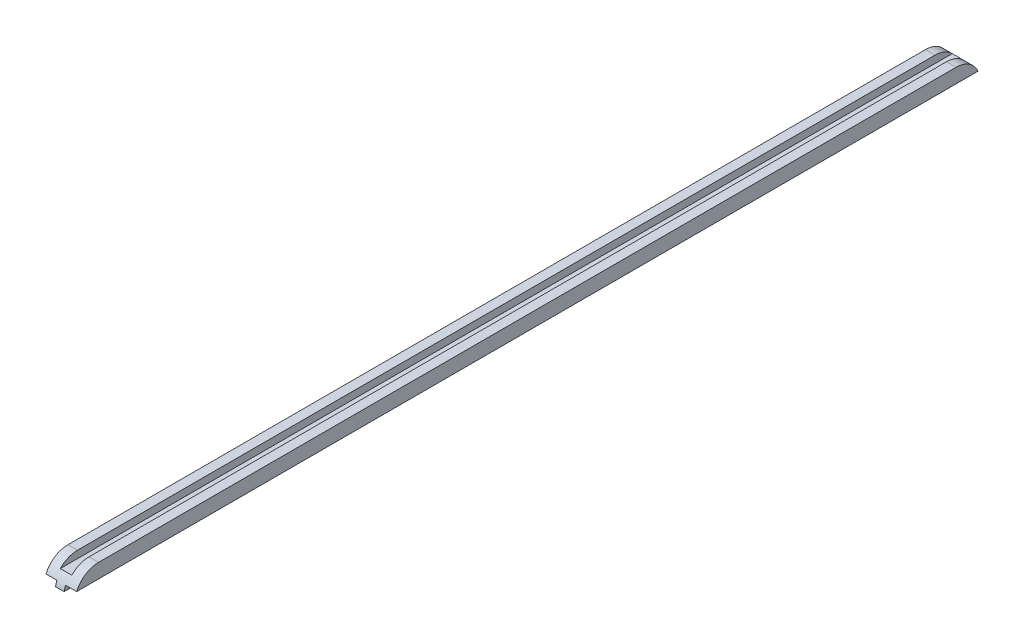
ISO-10303-21;
HEADER;
FILE_DESCRIPTION(('STEP AP214'),'2;1');
FILE_NAME('part.step','',(''),(''),'','','');
FILE_SCHEMA(('AUTOMOTIVE_DESIGN { 1 0 10303 214 1 1 1 1 }'));
ENDSEC;
DATA;
#1=APPLICATION_CONTEXT('core data for automotive mechanical design processes');
#2=APPLICATION_PROTOCOL_DEFINITION('international standard','automotive_design',2000,#1);
#3=PRODUCT_CONTEXT('',#1,'mechanical');
#4=PRODUCT('Part','Part','',(#3));
#5=PRODUCT_RELATED_PRODUCT_CATEGORY('part','',(#4));
#6=PRODUCT_DEFINITION_FORMATION('','',#4);
#7=PRODUCT_DEFINITION_CONTEXT('part definition',#1,'design');
#8=PRODUCT_DEFINITION('design','',#6,#7);
#9=PRODUCT_DEFINITION_SHAPE('','',#8);
#10=(LENGTH_UNIT() NAMED_UNIT(*) SI_UNIT(.MILLI.,.METRE.));
#11=(NAMED_UNIT(*) PLANE_ANGLE_UNIT() SI_UNIT($,.RADIAN.));
#12=(NAMED_UNIT(*) SI_UNIT($,.STERADIAN.) SOLID_ANGLE_UNIT());
#13=UNCERTAINTY_MEASURE_WITH_UNIT(LENGTH_MEASURE(1.E-05),#10,'distance_accuracy_value','');
#14=(GEOMETRIC_REPRESENTATION_CONTEXT(3) GLOBAL_UNCERTAINTY_ASSIGNED_CONTEXT((#13)) GLOBAL_UNIT_ASSIGNED_CONTEXT((#10,
#11,#12)) REPRESENTATION_CONTEXT('',''));
#15=CARTESIAN_POINT('',(0.,0.,0.));
#16=DIRECTION('',(0.,0.,1.));
#17=DIRECTION('',(1.,0.,0.));
#18=AXIS2_PLACEMENT_3D('',#15,#16,#17);
#19=CARTESIAN_POINT('',(-2.65740740740741,0.,189.));
#20=DIRECTION('',(0.,1.,0.));
#21=DIRECTION('',(0.,0.,1.));
#22=AXIS2_PLACEMENT_3D('',#19,#20,#21);
#23=PLANE('',#22);
#24=DIRECTION('',(0.,0.,1.));
#25=VECTOR('',#24,1.);
#26=CARTESIAN_POINT('',(1.44259259259259,0.,-2.05912602819741));
#27=LINE('',#26,#25);
#28=CARTESIAN_POINT('',(1.44259259259259,0.,0.316403790610517));
#29=VERTEX_POINT('',#28);
#30=CARTESIAN_POINT('',(1.44259259259259,0.,188.683596209389));
#31=VERTEX_POINT('',#30);
#32=EDGE_CURVE('E168',#29,#31,#27,.T.);
#33=ORIENTED_EDGE('',*,*,#32,.F.);
#34=DIRECTION('',(1.,0.,0.));
#35=VECTOR('',#34,1.);
#36=CARTESIAN_POINT('',(1.44259259259259,0.,0.316403790610517));
#37=LINE('',#36,#35);
#38=CARTESIAN_POINT('',(3.74259259259259,0.,0.316403790610516));
#39=VERTEX_POINT('',#38);
#40=EDGE_CURVE('E50',#29,#39,#37,.T.);
#41=ORIENTED_EDGE('',*,*,#40,.T.);
#42=DIRECTION('',(0.,0.,-1.));
#43=VECTOR('',#42,1.);
#44=CARTESIAN_POINT('',(3.74259259259259,0.,189.));
#45=LINE('',#44,#43);
#46=CARTESIAN_POINT('',(3.74259259259259,0.,188.683596209389));
#47=VERTEX_POINT('',#46);
#48=EDGE_CURVE('E182',#47,#39,#45,.T.);
#49=ORIENTED_EDGE('',*,*,#48,.F.);
#50=DIRECTION('',(1.,0.,0.));
#51=VECTOR('',#50,1.);
#52=CARTESIAN_POINT('',(3.74259259259259,0.,188.683596209389));
#53=LINE('',#52,#51);
#54=EDGE_CURVE('E260',#47,#31,#53,.F.);
#55=ORIENTED_EDGE('',*,*,#54,.T.);
#56=EDGE_LOOP('',(#33,#41,#49,#55));
#57=FACE_BOUND('',#56,.T.);
#58=ADVANCED_FACE('F33',(#57),#23,.F.);
#59=CARTESIAN_POINT('',(3.74259259259259,0.,189.));
#60=DIRECTION('',(-1.,0.,0.));
#61=DIRECTION('',(0.,0.,1.));
#62=AXIS2_PLACEMENT_3D('',#59,#60,#61);
#63=PLANE('',#62);
#64=ORIENTED_EDGE('',*,*,#48,.T.);
#65=CARTESIAN_POINT('',(3.74259259259259,-2.,4.89897948556636));
#66=DIRECTION('',(-1.,0.,0.));
#67=DIRECTION('',(0.,0.,1.));
#68=AXIS2_PLACEMENT_3D('',#65,#66,#67);
#69=CIRCLE('',#68,5.);
#70=CARTESIAN_POINT('',(3.74259259259259,3.,4.89897948556636));
#71=VERTEX_POINT('',#70);
#72=EDGE_CURVE('E11',#39,#71,#69,.F.);
#73=ORIENTED_EDGE('',*,*,#72,.T.);
#74=DIRECTION('',(0.,0.,-1.));
#75=VECTOR('',#74,1.);
#76=CARTESIAN_POINT('',(3.74259259259259,3.,189.));
#77=LINE('',#76,#75);
#78=CARTESIAN_POINT('',(3.74259259259259,3.,184.101020514434));
#79=VERTEX_POINT('',#78);
#80=EDGE_CURVE('E215',#79,#71,#77,.T.);
#81=ORIENTED_EDGE('',*,*,#80,.F.);
#82=CARTESIAN_POINT('',(3.74259259259259,-2.,184.101020514434));
#83=DIRECTION('',(-1.,0.,0.));
#84=DIRECTION('',(0.,0.,1.));
#85=AXIS2_PLACEMENT_3D('',#82,#83,#84);
#86=CIRCLE('',#85,5.);
#87=EDGE_CURVE('E42',#79,#47,#86,.F.);
#88=ORIENTED_EDGE('',*,*,#87,.T.);
#89=EDGE_LOOP('',(#64,#73,#81,#88));
#90=FACE_BOUND('',#89,.T.);
#91=ADVANCED_FACE('F217',(#90),#63,.F.);
#92=CARTESIAN_POINT('',(3.74259259259259,3.,189.));
#93=DIRECTION('',(0.,-1.,0.));
#94=DIRECTION('',(0.,0.,-1.));
#95=AXIS2_PLACEMENT_3D('',#92,#93,#94);
#96=PLANE('',#95);
#97=ORIENTED_EDGE('',*,*,#80,.T.);
#98=DIRECTION('',(1.,0.,0.));
#99=VECTOR('',#98,1.);
#100=CARTESIAN_POINT('',(3.74259259259259,3.,4.89897948556636));
#101=LINE('',#100,#99);
#102=CARTESIAN_POINT('',(1.74259259259259,3.,4.89897948556636));
#103=VERTEX_POINT('',#102);
#104=EDGE_CURVE('E161',#71,#103,#101,.F.);
#105=ORIENTED_EDGE('',*,*,#104,.T.);
#106=DIRECTION('',(0.,0.,-1.));
#107=VECTOR('',#106,1.);
#108=CARTESIAN_POINT('',(1.74259259259259,3.,189.));
#109=LINE('',#108,#107);
#110=CARTESIAN_POINT('',(1.74259259259259,3.,184.101020514434));
#111=VERTEX_POINT('',#110);
#112=EDGE_CURVE('E208',#111,#103,#109,.T.);
#113=ORIENTED_EDGE('',*,*,#112,.F.);
#114=DIRECTION('',(1.,0.,0.));
#115=VECTOR('',#114,1.);
#116=CARTESIAN_POINT('',(3.74259259259259,3.,184.101020514434));
#117=LINE('',#116,#115);
#118=EDGE_CURVE('E159',#111,#79,#117,.T.);
#119=ORIENTED_EDGE('',*,*,#118,.T.);
#120=EDGE_LOOP('',(#97,#105,#113,#119));
#121=FACE_BOUND('',#120,.T.);
#122=ADVANCED_FACE('F214',(#121),#96,.F.);
#123=CARTESIAN_POINT('',(1.74259259259259,3.,189.));
#124=DIRECTION('',(1.,0.,0.));
#125=DIRECTION('',(0.,1.,0.));
#126=AXIS2_PLACEMENT_3D('',#123,#124,#125);
#127=PLANE('',#126);
#128=ORIENTED_EDGE('',*,*,#112,.T.);
#129=CARTESIAN_POINT('',(1.74259259259259,-2.,4.89897948556636));
#130=DIRECTION('',(1.,0.,0.));
#131=DIRECTION('',(0.,1.,0.));
#132=AXIS2_PLACEMENT_3D('',#129,#130,#131);
#133=CIRCLE('',#132,5.);
#134=CARTESIAN_POINT('',(1.74259259259259,1.47685185185185,1.30572174358981));
#135=VERTEX_POINT('',#134);
#136=EDGE_CURVE('E165',#103,#135,#133,.F.);
#137=ORIENTED_EDGE('',*,*,#136,.T.);
#138=DIRECTION('',(0.,0.,-1.));
#139=VECTOR('',#138,1.);
#140=CARTESIAN_POINT('',(1.74259259259259,1.47685185185185,189.));
#141=LINE('',#140,#139);
#142=CARTESIAN_POINT('',(1.74259259259259,1.47685185185185,187.69427825641));
#143=VERTEX_POINT('',#142);
#144=EDGE_CURVE('E197',#143,#135,#141,.T.);
#145=ORIENTED_EDGE('',*,*,#144,.F.);
#146=CARTESIAN_POINT('',(1.74259259259259,-2.,184.101020514434));
#147=DIRECTION('',(1.,0.,0.));
#148=DIRECTION('',(0.,1.,0.));
#149=AXIS2_PLACEMENT_3D('',#146,#147,#148);
#150=CIRCLE('',#149,5.);
#151=EDGE_CURVE('E163',#143,#111,#150,.F.);
#152=ORIENTED_EDGE('',*,*,#151,.T.);
#153=EDGE_LOOP('',(#128,#137,#145,#152));
#154=FACE_BOUND('',#153,.T.);
#155=ADVANCED_FACE('F205',(#154),#127,.F.);
#156=CARTESIAN_POINT('',(1.74259259259259,1.47685185185185,189.));
#157=DIRECTION('',(0.,-1.,0.));
#158=DIRECTION('',(1.,0.,0.));
#159=AXIS2_PLACEMENT_3D('',#156,#157,#158);
#160=PLANE('',#159);
#161=DIRECTION('',(1.,0.,0.));
#162=VECTOR('',#161,1.);
#163=CARTESIAN_POINT('',(1.74259259259259,1.47685185185185,1.30572174358982));
#164=LINE('',#163,#162);
#165=CARTESIAN_POINT('',(-0.657407407407413,1.47685185185185,1.30572174358981));
#166=VERTEX_POINT('',#165);
#167=EDGE_CURVE('E157',#135,#166,#164,.F.);
#168=ORIENTED_EDGE('',*,*,#167,.T.);
#169=DIRECTION('',(0.,0.,-1.));
#170=VECTOR('',#169,1.);
#171=CARTESIAN_POINT('',(-0.657407407407413,1.47685185185185,189.));
#172=LINE('',#171,#170);
#173=CARTESIAN_POINT('',(-0.657407407407413,1.47685185185185,187.69427825641));
#174=VERTEX_POINT('',#173);
#175=EDGE_CURVE('E200',#174,#166,#172,.T.);
#176=ORIENTED_EDGE('',*,*,#175,.F.);
#177=DIRECTION('',(1.,0.,0.));
#178=VECTOR('',#177,1.);
#179=CARTESIAN_POINT('',(-0.657407407407413,1.47685185185185,187.69427825641));
#180=LINE('',#179,#178);
#181=EDGE_CURVE('E149',#174,#143,#180,.T.);
#182=ORIENTED_EDGE('',*,*,#181,.T.);
#183=ORIENTED_EDGE('',*,*,#144,.T.);
#184=EDGE_LOOP('',(#168,#176,#182,#183));
#185=FACE_BOUND('',#184,.T.);
#186=ADVANCED_FACE('F196',(#185),#160,.F.);
#187=CARTESIAN_POINT('',(-0.657407407407413,1.47685185185185,189.));
#188=DIRECTION('',(-1.,0.,0.));
#189=DIRECTION('',(0.,-1.,0.));
#190=AXIS2_PLACEMENT_3D('',#187,#188,#189);
#191=PLANE('',#190);
#192=ORIENTED_EDGE('',*,*,#175,.T.);
#193=CARTESIAN_POINT('',(-0.657407407407413,-2.,4.89897948556636));
#194=DIRECTION('',(-1.,0.,0.));
#195=DIRECTION('',(0.,-1.,0.));
#196=AXIS2_PLACEMENT_3D('',#193,#194,#195);
#197=CIRCLE('',#196,5.);
#198=CARTESIAN_POINT('',(-0.657407407407413,3.,4.89897948556636));
#199=VERTEX_POINT('',#198);
#200=EDGE_CURVE('E156',#166,#199,#197,.F.);
#201=ORIENTED_EDGE('',*,*,#200,.T.);
#202=DIRECTION('',(0.,0.,-1.));
#203=VECTOR('',#202,1.);
#204=CARTESIAN_POINT('',(-0.657407407407413,3.,189.));
#205=LINE('',#204,#203);
#206=CARTESIAN_POINT('',(-0.657407407407413,3.,184.101020514434));
#207=VERTEX_POINT('',#206);
#208=EDGE_CURVE('E247',#207,#199,#205,.T.);
#209=ORIENTED_EDGE('',*,*,#208,.F.);
#210=CARTESIAN_POINT('',(-0.657407407407413,-2.,184.101020514434));
#211=DIRECTION('',(-1.,0.,0.));
#212=DIRECTION('',(0.,-1.,0.));
#213=AXIS2_PLACEMENT_3D('',#210,#211,#212);
#214=CIRCLE('',#213,5.);
#215=EDGE_CURVE('E154',#207,#174,#214,.F.);
#216=ORIENTED_EDGE('',*,*,#215,.T.);
#217=EDGE_LOOP('',(#192,#201,#209,#216));
#218=FACE_BOUND('',#217,.T.);
#219=ADVANCED_FACE('F250',(#218),#191,.F.);
#220=CARTESIAN_POINT('',(-0.657407407407413,3.,189.));
#221=DIRECTION('',(0.,-1.,0.));
#222=DIRECTION('',(0.,0.,-1.));
#223=AXIS2_PLACEMENT_3D('',#220,#221,#222);
#224=PLANE('',#223);
#225=ORIENTED_EDGE('',*,*,#208,.T.);
#226=DIRECTION('',(1.,0.,0.));
#227=VECTOR('',#226,1.);
#228=CARTESIAN_POINT('',(-0.657407407407413,3.,4.89897948556636));
#229=LINE('',#228,#227);
#230=CARTESIAN_POINT('',(-2.65740740740741,3.,4.89897948556636));
#231=VERTEX_POINT('',#230);
#232=EDGE_CURVE('E221',#199,#231,#229,.F.);
#233=ORIENTED_EDGE('',*,*,#232,.T.);
#234=DIRECTION('',(0.,0.,-1.));
#235=VECTOR('',#234,1.);
#236=CARTESIAN_POINT('',(-2.65740740740741,3.,189.));
#237=LINE('',#236,#235);
#238=CARTESIAN_POINT('',(-2.65740740740741,3.,184.101020514434));
#239=VERTEX_POINT('',#238);
#240=EDGE_CURVE('E241',#239,#231,#237,.T.);
#241=ORIENTED_EDGE('',*,*,#240,.F.);
#242=DIRECTION('',(1.,0.,0.));
#243=VECTOR('',#242,1.);
#244=CARTESIAN_POINT('',(-0.657407407407413,3.,184.101020514434));
#245=LINE('',#244,#243);
#246=EDGE_CURVE('E219',#239,#207,#245,.T.);
#247=ORIENTED_EDGE('',*,*,#246,.T.);
#248=EDGE_LOOP('',(#225,#233,#241,#247));
#249=FACE_BOUND('',#248,.T.);
#250=ADVANCED_FACE('F246',(#249),#224,.F.);
#251=CARTESIAN_POINT('',(-2.65740740740741,3.,189.));
#252=DIRECTION('',(1.,0.,0.));
#253=DIRECTION('',(0.,1.,0.));
#254=AXIS2_PLACEMENT_3D('',#251,#252,#253);
#255=PLANE('',#254);
#256=ORIENTED_EDGE('',*,*,#240,.T.);
#257=CARTESIAN_POINT('',(-2.65740740740741,-2.,4.89897948556636));
#258=DIRECTION('',(1.,0.,0.));
#259=DIRECTION('',(0.,1.,0.));
#260=AXIS2_PLACEMENT_3D('',#257,#258,#259);
#261=CIRCLE('',#260,5.);
#262=CARTESIAN_POINT('',(-2.65740740740741,0.,0.316403790610514));
#263=VERTEX_POINT('',#262);
#264=EDGE_CURVE('E229',#231,#263,#261,.F.);
#265=ORIENTED_EDGE('',*,*,#264,.T.);
#266=DIRECTION('',(0.,0.,-1.));
#267=VECTOR('',#266,1.);
#268=CARTESIAN_POINT('',(-2.65740740740741,0.,189.));
#269=LINE('',#268,#267);
#270=CARTESIAN_POINT('',(-2.65740740740741,0.,188.683596209389));
#271=VERTEX_POINT('',#270);
#272=EDGE_CURVE('E235',#271,#263,#269,.T.);
#273=ORIENTED_EDGE('',*,*,#272,.F.);
#274=CARTESIAN_POINT('',(-2.65740740740741,-2.,184.101020514434));
#275=DIRECTION('',(1.,0.,0.));
#276=DIRECTION('',(0.,1.,0.));
#277=AXIS2_PLACEMENT_3D('',#274,#275,#276);
#278=CIRCLE('',#277,5.);
#279=EDGE_CURVE('E227',#271,#239,#278,.F.);
#280=ORIENTED_EDGE('',*,*,#279,.T.);
#281=EDGE_LOOP('',(#256,#265,#273,#280));
#282=FACE_BOUND('',#281,.T.);
#283=ADVANCED_FACE('F239',(#282),#255,.F.);
#284=ORIENTED_EDGE('',*,*,#272,.T.);
#285=DIRECTION('',(1.,0.,0.));
#286=VECTOR('',#285,1.);
#287=CARTESIAN_POINT('',(-2.65740740740741,0.,0.316403790610523));
#288=LINE('',#287,#286);
#289=CARTESIAN_POINT('',(-0.357407407407412,0.,0.316403790610517));
#290=VERTEX_POINT('',#289);
#291=EDGE_CURVE('E147',#263,#290,#288,.T.);
#292=ORIENTED_EDGE('',*,*,#291,.T.);
#293=DIRECTION('',(0.,0.,1.));
#294=VECTOR('',#293,1.);
#295=CARTESIAN_POINT('',(-0.357407407407412,0.,-2.05912602819741));
#296=LINE('',#295,#294);
#297=CARTESIAN_POINT('',(-0.357407407407412,0.,188.683596209389));
#298=VERTEX_POINT('',#297);
#299=EDGE_CURVE('E172',#290,#298,#296,.T.);
#300=ORIENTED_EDGE('',*,*,#299,.T.);
#301=DIRECTION('',(1.,0.,0.));
#302=VECTOR('',#301,1.);
#303=CARTESIAN_POINT('',(-0.357407407407412,0.,188.683596209389));
#304=LINE('',#303,#302);
#305=EDGE_CURVE('E146',#298,#271,#304,.F.);
#306=ORIENTED_EDGE('',*,*,#305,.T.);
#307=EDGE_LOOP('',(#284,#292,#300,#306));
#308=FACE_BOUND('',#307,.T.);
#309=ADVANCED_FACE('F234',(#308),#23,.F.);
#310=CARTESIAN_POINT('',(-0.357407407407412,0.,-2.05912602819741));
#311=DIRECTION('',(-1.,0.,0.));
#312=DIRECTION('',(0.,-1.,0.));
#313=AXIS2_PLACEMENT_3D('',#310,#311,#312);
#314=PLANE('',#313);
#315=ORIENTED_EDGE('',*,*,#299,.F.);
#316=CARTESIAN_POINT('',(-0.357407407407413,-2.,4.89897948556636));
#317=DIRECTION('',(-1.,0.,0.));
#318=DIRECTION('',(0.,-1.,0.));
#319=AXIS2_PLACEMENT_3D('',#316,#317,#318);
#320=CIRCLE('',#319,5.);
#321=CARTESIAN_POINT('',(-0.357407407407412,-1.,0.));
#322=VERTEX_POINT('',#321);
#323=EDGE_CURVE('E132',#290,#322,#320,.T.);
#324=ORIENTED_EDGE('',*,*,#323,.T.);
#325=DIRECTION('',(0.,0.,1.));
#326=VECTOR('',#325,1.);
#327=CARTESIAN_POINT('',(-0.357407407407412,-1.,-2.05912602819741));
#328=LINE('',#327,#326);
#329=CARTESIAN_POINT('',(-0.357407407407412,-1.,189.));
#330=VERTEX_POINT('',#329);
#331=EDGE_CURVE('E124',#322,#330,#328,.T.);
#332=ORIENTED_EDGE('',*,*,#331,.T.);
#333=CARTESIAN_POINT('',(-0.357407407407413,-2.,184.101020514434));
#334=DIRECTION('',(-1.,0.,0.));
#335=DIRECTION('',(0.,-1.,0.));
#336=AXIS2_PLACEMENT_3D('',#333,#334,#335);
#337=CIRCLE('',#336,5.);
#338=EDGE_CURVE('E129',#330,#298,#337,.T.);
#339=ORIENTED_EDGE('',*,*,#338,.T.);
#340=EDGE_LOOP('',(#315,#324,#332,#339));
#341=FACE_BOUND('',#340,.T.);
#342=ADVANCED_FACE('F127',(#341),#314,.T.);
#343=CARTESIAN_POINT('',(1.44259259259259,0.,-2.05912602819741));
#344=DIRECTION('',(1.,0.,0.));
#345=DIRECTION('',(0.,1.,0.));
#346=AXIS2_PLACEMENT_3D('',#343,#344,#345);
#347=PLANE('',#346);
#348=DIRECTION('',(0.,0.,1.));
#349=VECTOR('',#348,1.);
#350=CARTESIAN_POINT('',(1.44259259259259,-1.,-2.05912602819741));
#351=LINE('',#350,#349);
#352=CARTESIAN_POINT('',(1.44259259259259,-1.,0.));
#353=VERTEX_POINT('',#352);
#354=CARTESIAN_POINT('',(1.44259259259259,-1.,189.));
#355=VERTEX_POINT('',#354);
#356=EDGE_CURVE('E135',#353,#355,#351,.T.);
#357=ORIENTED_EDGE('',*,*,#356,.F.);
#358=CARTESIAN_POINT('',(1.44259259259259,-2.,4.89897948556636));
#359=DIRECTION('',(1.,0.,0.));
#360=DIRECTION('',(0.,1.,0.));
#361=AXIS2_PLACEMENT_3D('',#358,#359,#360);
#362=CIRCLE('',#361,5.);
#363=EDGE_CURVE('E258',#353,#29,#362,.T.);
#364=ORIENTED_EDGE('',*,*,#363,.T.);
#365=ORIENTED_EDGE('',*,*,#32,.T.);
#366=CARTESIAN_POINT('',(1.44259259259259,-2.,184.101020514434));
#367=DIRECTION('',(1.,0.,0.));
#368=DIRECTION('',(0.,1.,0.));
#369=AXIS2_PLACEMENT_3D('',#366,#367,#368);
#370=CIRCLE('',#369,5.);
#371=EDGE_CURVE('E167',#31,#355,#370,.T.);
#372=ORIENTED_EDGE('',*,*,#371,.T.);
#373=EDGE_LOOP('',(#357,#364,#365,#372));
#374=FACE_BOUND('',#373,.T.);
#375=ADVANCED_FACE('F263',(#374),#347,.T.);
#376=CARTESIAN_POINT('',(-0.357407407407412,-1.,-2.05912602819741));
#377=DIRECTION('',(0.,-1.,0.));
#378=DIRECTION('',(0.,0.,-1.));
#379=AXIS2_PLACEMENT_3D('',#376,#377,#378);
#380=PLANE('',#379);
#381=DIRECTION('',(-1.,0.,0.));
#382=VECTOR('',#381,1.);
#383=CARTESIAN_POINT('',(-0.357407407407412,-1.,0.));
#384=LINE('',#383,#382);
#385=EDGE_CURVE('E185',#353,#322,#384,.T.);
#386=ORIENTED_EDGE('',*,*,#385,.F.);
#387=ORIENTED_EDGE('',*,*,#356,.T.);
#388=DIRECTION('',(1.,0.,0.));
#389=VECTOR('',#388,1.);
#390=CARTESIAN_POINT('',(-0.357407407407412,-1.,189.));
#391=LINE('',#390,#389);
#392=EDGE_CURVE('E136',#330,#355,#391,.T.);
#393=ORIENTED_EDGE('',*,*,#392,.F.);
#394=ORIENTED_EDGE('',*,*,#331,.F.);
#395=EDGE_LOOP('',(#386,#387,#393,#394));
#396=FACE_BOUND('',#395,.T.);
#397=ADVANCED_FACE('F139',(#396),#380,.T.);
#398=CARTESIAN_POINT('',(0.,-2.,4.89897948556636));
#399=DIRECTION('',(1.,0.,0.));
#400=DIRECTION('',(0.,0.,-1.));
#401=AXIS2_PLACEMENT_3D('',#398,#399,#400);
#402=CYLINDRICAL_SURFACE('',#401,5.);
#403=ORIENTED_EDGE('',*,*,#363,.F.);
#404=ORIENTED_EDGE('',*,*,#385,.T.);
#405=ORIENTED_EDGE('',*,*,#323,.F.);
#406=ORIENTED_EDGE('',*,*,#291,.F.);
#407=ORIENTED_EDGE('',*,*,#264,.F.);
#408=ORIENTED_EDGE('',*,*,#232,.F.);
#409=ORIENTED_EDGE('',*,*,#200,.F.);
#410=ORIENTED_EDGE('',*,*,#167,.F.);
#411=ORIENTED_EDGE('',*,*,#136,.F.);
#412=ORIENTED_EDGE('',*,*,#104,.F.);
#413=ORIENTED_EDGE('',*,*,#72,.F.);
#414=ORIENTED_EDGE('',*,*,#40,.F.);
#415=EDGE_LOOP('',(#403,#404,#405,#406,#407,#408,#409,#410,#411,#412,#413,#414));
#416=FACE_BOUND('',#415,.T.);
#417=ADVANCED_FACE('F257',(#416),#402,.T.);
#418=CARTESIAN_POINT('',(0.,-2.,184.101020514434));
#419=DIRECTION('',(1.,0.,0.));
#420=DIRECTION('',(0.,0.,-1.));
#421=AXIS2_PLACEMENT_3D('',#418,#419,#420);
#422=CYLINDRICAL_SURFACE('',#421,5.);
#423=ORIENTED_EDGE('',*,*,#338,.F.);
#424=ORIENTED_EDGE('',*,*,#392,.T.);
#425=ORIENTED_EDGE('',*,*,#371,.F.);
#426=ORIENTED_EDGE('',*,*,#54,.F.);
#427=ORIENTED_EDGE('',*,*,#87,.F.);
#428=ORIENTED_EDGE('',*,*,#118,.F.);
#429=ORIENTED_EDGE('',*,*,#151,.F.);
#430=ORIENTED_EDGE('',*,*,#181,.F.);
#431=ORIENTED_EDGE('',*,*,#215,.F.);
#432=ORIENTED_EDGE('',*,*,#246,.F.);
#433=ORIENTED_EDGE('',*,*,#279,.F.);
#434=ORIENTED_EDGE('',*,*,#305,.F.);
#435=EDGE_LOOP('',(#423,#424,#425,#426,#427,#428,#429,#430,#431,#432,#433,#434));
#436=FACE_BOUND('',#435,.T.);
#437=ADVANCED_FACE('F35',(#436),#422,.T.);
#438=CLOSED_SHELL('',(#58,#91,#122,#155,#186,#219,#250,#283,#309,#342,#375,#397,#417,#437));
#439=MANIFOLD_SOLID_BREP('B2',#438);
#440=ADVANCED_BREP_SHAPE_REPRESENTATION('',(#18,#439),#14);
#441=SHAPE_DEFINITION_REPRESENTATION(#9,#440);
ENDSEC;
END-ISO-10303-21;
